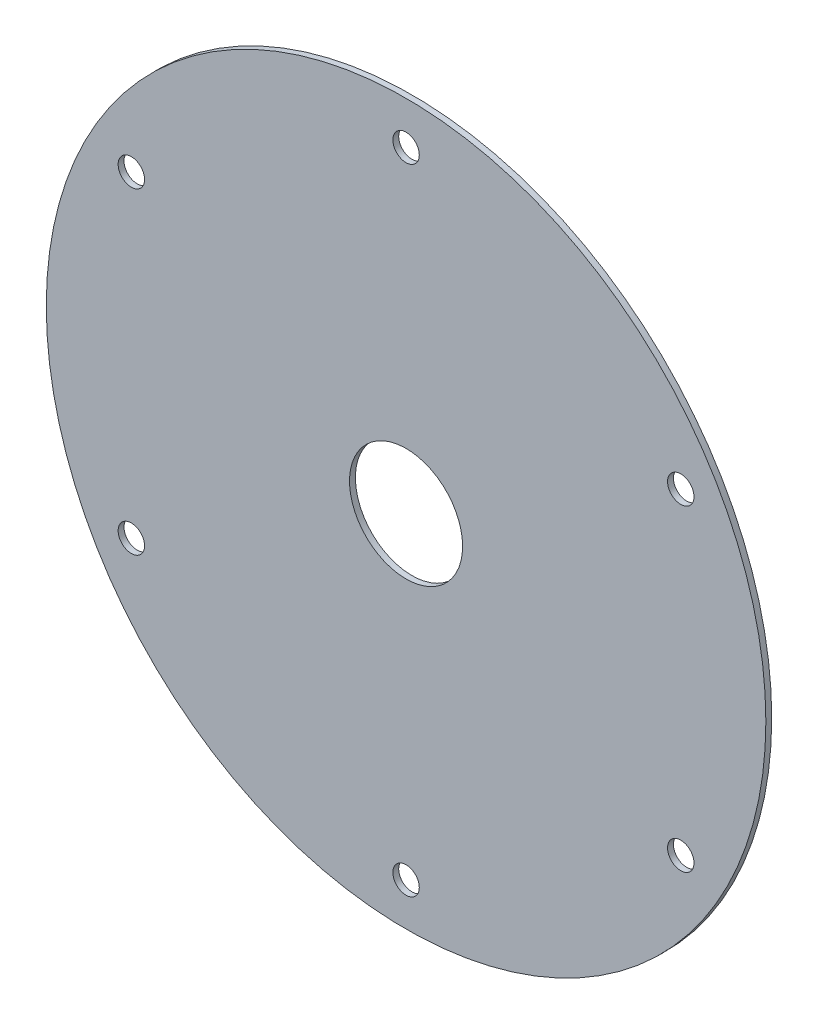
ISO-10303-21;
HEADER;
FILE_DESCRIPTION(('STEP AP214'),'2;1');
FILE_NAME('part.step','',(''),(''),'','','');
FILE_SCHEMA(('AUTOMOTIVE_DESIGN { 1 0 10303 214 1 1 1 1 }'));
ENDSEC;
DATA;
#1=APPLICATION_CONTEXT('core data for automotive mechanical design processes');
#2=APPLICATION_PROTOCOL_DEFINITION('international standard','automotive_design',2000,#1);
#3=PRODUCT_CONTEXT('',#1,'mechanical');
#4=PRODUCT('Part','Part','',(#3));
#5=PRODUCT_RELATED_PRODUCT_CATEGORY('part','',(#4));
#6=PRODUCT_DEFINITION_FORMATION('','',#4);
#7=PRODUCT_DEFINITION_CONTEXT('part definition',#1,'design');
#8=PRODUCT_DEFINITION('design','',#6,#7);
#9=PRODUCT_DEFINITION_SHAPE('','',#8);
#10=(LENGTH_UNIT() NAMED_UNIT(*) SI_UNIT(.MILLI.,.METRE.));
#11=(NAMED_UNIT(*) PLANE_ANGLE_UNIT() SI_UNIT($,.RADIAN.));
#12=(NAMED_UNIT(*) SI_UNIT($,.STERADIAN.) SOLID_ANGLE_UNIT());
#13=UNCERTAINTY_MEASURE_WITH_UNIT(LENGTH_MEASURE(1.E-05),#10,'distance_accuracy_value','');
#14=(GEOMETRIC_REPRESENTATION_CONTEXT(3) GLOBAL_UNCERTAINTY_ASSIGNED_CONTEXT((#13)) GLOBAL_UNIT_ASSIGNED_CONTEXT((#10,
#11,#12)) REPRESENTATION_CONTEXT('',''));
#15=CARTESIAN_POINT('',(0.,0.,0.));
#16=DIRECTION('',(0.,0.,1.));
#17=DIRECTION('',(1.,0.,0.));
#18=AXIS2_PLACEMENT_3D('',#15,#16,#17);
#19=CARTESIAN_POINT('',(0.,0.,4.));
#20=DIRECTION('',(0.,0.,1.));
#21=DIRECTION('',(1.,0.,0.));
#22=AXIS2_PLACEMENT_3D('',#19,#20,#21);
#23=PLANE('',#22);
#24=CARTESIAN_POINT('',(-187.061487217439,-108.,4.));
#25=DIRECTION('',(0.,0.,1.));
#26=DIRECTION('',(1.,0.,0.));
#27=AXIS2_PLACEMENT_3D('',#24,#25,#26);
#28=CIRCLE('',#27,9.00000000000001);
#29=CARTESIAN_POINT('',(-178.061487217439,-108.,4.));
#30=VERTEX_POINT('',#29);
#31=EDGE_CURVE('E75',#30,#30,#28,.T.);
#32=ORIENTED_EDGE('',*,*,#31,.F.);
#33=EDGE_LOOP('',(#32));
#34=FACE_BOUND('',#33,.T.);
#35=CARTESIAN_POINT('',(187.061487217439,-108.,4.));
#36=DIRECTION('',(0.,0.,1.));
#37=DIRECTION('',(1.,0.,0.));
#38=AXIS2_PLACEMENT_3D('',#35,#36,#37);
#39=CIRCLE('',#38,9.00000000000001);
#40=CARTESIAN_POINT('',(196.061487217439,-108.,4.));
#41=VERTEX_POINT('',#40);
#42=EDGE_CURVE('E63',#41,#41,#39,.T.);
#43=ORIENTED_EDGE('',*,*,#42,.F.);
#44=EDGE_LOOP('',(#43));
#45=FACE_BOUND('',#44,.T.);
#46=CARTESIAN_POINT('',(0.,216.,4.));
#47=DIRECTION('',(0.,0.,1.));
#48=DIRECTION('',(1.,0.,0.));
#49=AXIS2_PLACEMENT_3D('',#46,#47,#48);
#50=CIRCLE('',#49,9.);
#51=CARTESIAN_POINT('',(9.,216.,4.));
#52=VERTEX_POINT('',#51);
#53=EDGE_CURVE('E51',#52,#52,#50,.T.);
#54=ORIENTED_EDGE('',*,*,#53,.F.);
#55=EDGE_LOOP('',(#54));
#56=FACE_BOUND('',#55,.T.);
#57=CARTESIAN_POINT('',(0.,0.,4.));
#58=DIRECTION('',(0.,0.,1.));
#59=DIRECTION('',(1.,0.,0.));
#60=AXIS2_PLACEMENT_3D('',#57,#58,#59);
#61=CIRCLE('',#60,245.);
#62=CARTESIAN_POINT('',(245.,0.,4.));
#63=VERTEX_POINT('',#62);
#64=EDGE_CURVE('E10',#63,#63,#61,.T.);
#65=ORIENTED_EDGE('',*,*,#64,.T.);
#66=EDGE_LOOP('',(#65));
#67=FACE_BOUND('',#66,.T.);
#68=CARTESIAN_POINT('',(0.,0.,4.));
#69=DIRECTION('',(0.,0.,1.));
#70=DIRECTION('',(1.,0.,0.));
#71=AXIS2_PLACEMENT_3D('',#68,#69,#70);
#72=CIRCLE('',#71,38.5);
#73=CARTESIAN_POINT('',(38.5,0.,4.));
#74=VERTEX_POINT('',#73);
#75=EDGE_CURVE('E46',#74,#74,#72,.T.);
#76=ORIENTED_EDGE('',*,*,#75,.F.);
#77=EDGE_LOOP('',(#76));
#78=FACE_BOUND('',#77,.T.);
#79=CARTESIAN_POINT('',(187.061487217439,108.,4.));
#80=DIRECTION('',(0.,0.,1.));
#81=DIRECTION('',(1.,0.,0.));
#82=AXIS2_PLACEMENT_3D('',#79,#80,#81);
#83=CIRCLE('',#82,8.99999999999998);
#84=CARTESIAN_POINT('',(196.061487217439,108.,4.));
#85=VERTEX_POINT('',#84);
#86=EDGE_CURVE('E57',#85,#85,#83,.T.);
#87=ORIENTED_EDGE('',*,*,#86,.F.);
#88=EDGE_LOOP('',(#87));
#89=FACE_BOUND('',#88,.T.);
#90=CARTESIAN_POINT('',(0.,-216.,4.));
#91=DIRECTION('',(0.,0.,1.));
#92=DIRECTION('',(1.,0.,0.));
#93=AXIS2_PLACEMENT_3D('',#90,#91,#92);
#94=CIRCLE('',#93,9.);
#95=CARTESIAN_POINT('',(9.00000000000002,-216.,4.));
#96=VERTEX_POINT('',#95);
#97=EDGE_CURVE('E69',#96,#96,#94,.T.);
#98=ORIENTED_EDGE('',*,*,#97,.F.);
#99=EDGE_LOOP('',(#98));
#100=FACE_BOUND('',#99,.T.);
#101=CARTESIAN_POINT('',(-187.061487217439,108.,4.));
#102=DIRECTION('',(0.,0.,1.));
#103=DIRECTION('',(1.,0.,0.));
#104=AXIS2_PLACEMENT_3D('',#101,#102,#103);
#105=CIRCLE('',#104,8.99999999999998);
#106=CARTESIAN_POINT('',(-178.061487217439,108.,4.));
#107=VERTEX_POINT('',#106);
#108=EDGE_CURVE('E81',#107,#107,#105,.T.);
#109=ORIENTED_EDGE('',*,*,#108,.F.);
#110=EDGE_LOOP('',(#109));
#111=FACE_BOUND('',#110,.T.);
#112=ADVANCED_FACE('F35',(#34,#45,#56,#67,#78,#89,#100,#111),#23,.T.);
#113=CARTESIAN_POINT('',(0.,0.,0.));
#114=DIRECTION('',(0.,0.,1.));
#115=DIRECTION('',(1.,0.,0.));
#116=AXIS2_PLACEMENT_3D('',#113,#114,#115);
#117=PLANE('',#116);
#118=CARTESIAN_POINT('',(0.,0.,0.));
#119=DIRECTION('',(0.,0.,1.));
#120=DIRECTION('',(1.,0.,0.));
#121=AXIS2_PLACEMENT_3D('',#118,#119,#120);
#122=CIRCLE('',#121,245.);
#123=CARTESIAN_POINT('',(245.,0.,0.));
#124=VERTEX_POINT('',#123);
#125=EDGE_CURVE('E39',#124,#124,#122,.T.);
#126=ORIENTED_EDGE('',*,*,#125,.F.);
#127=EDGE_LOOP('',(#126));
#128=FACE_BOUND('',#127,.T.);
#129=CARTESIAN_POINT('',(0.,0.,0.));
#130=DIRECTION('',(0.,0.,1.));
#131=DIRECTION('',(1.,0.,0.));
#132=AXIS2_PLACEMENT_3D('',#129,#130,#131);
#133=CIRCLE('',#132,38.5);
#134=CARTESIAN_POINT('',(38.5,0.,0.));
#135=VERTEX_POINT('',#134);
#136=EDGE_CURVE('E48',#135,#135,#133,.T.);
#137=ORIENTED_EDGE('',*,*,#136,.T.);
#138=EDGE_LOOP('',(#137));
#139=FACE_BOUND('',#138,.T.);
#140=CARTESIAN_POINT('',(0.,216.,0.));
#141=DIRECTION('',(0.,0.,1.));
#142=DIRECTION('',(1.,0.,0.));
#143=AXIS2_PLACEMENT_3D('',#140,#141,#142);
#144=CIRCLE('',#143,9.);
#145=CARTESIAN_POINT('',(9.,216.,0.));
#146=VERTEX_POINT('',#145);
#147=EDGE_CURVE('E54',#146,#146,#144,.T.);
#148=ORIENTED_EDGE('',*,*,#147,.T.);
#149=EDGE_LOOP('',(#148));
#150=FACE_BOUND('',#149,.T.);
#151=CARTESIAN_POINT('',(187.061487217439,108.,0.));
#152=DIRECTION('',(0.,0.,1.));
#153=DIRECTION('',(1.,0.,0.));
#154=AXIS2_PLACEMENT_3D('',#151,#152,#153);
#155=CIRCLE('',#154,8.99999999999998);
#156=CARTESIAN_POINT('',(196.061487217439,108.,0.));
#157=VERTEX_POINT('',#156);
#158=EDGE_CURVE('E60',#157,#157,#155,.T.);
#159=ORIENTED_EDGE('',*,*,#158,.T.);
#160=EDGE_LOOP('',(#159));
#161=FACE_BOUND('',#160,.T.);
#162=CARTESIAN_POINT('',(187.061487217439,-108.,0.));
#163=DIRECTION('',(0.,0.,1.));
#164=DIRECTION('',(1.,0.,0.));
#165=AXIS2_PLACEMENT_3D('',#162,#163,#164);
#166=CIRCLE('',#165,9.00000000000001);
#167=CARTESIAN_POINT('',(196.061487217439,-108.,0.));
#168=VERTEX_POINT('',#167);
#169=EDGE_CURVE('E66',#168,#168,#166,.T.);
#170=ORIENTED_EDGE('',*,*,#169,.T.);
#171=EDGE_LOOP('',(#170));
#172=FACE_BOUND('',#171,.T.);
#173=CARTESIAN_POINT('',(0.,-216.,0.));
#174=DIRECTION('',(0.,0.,1.));
#175=DIRECTION('',(1.,0.,0.));
#176=AXIS2_PLACEMENT_3D('',#173,#174,#175);
#177=CIRCLE('',#176,9.);
#178=CARTESIAN_POINT('',(9.00000000000002,-216.,0.));
#179=VERTEX_POINT('',#178);
#180=EDGE_CURVE('E72',#179,#179,#177,.T.);
#181=ORIENTED_EDGE('',*,*,#180,.T.);
#182=EDGE_LOOP('',(#181));
#183=FACE_BOUND('',#182,.T.);
#184=CARTESIAN_POINT('',(-187.061487217439,-108.,0.));
#185=DIRECTION('',(0.,0.,1.));
#186=DIRECTION('',(1.,0.,0.));
#187=AXIS2_PLACEMENT_3D('',#184,#185,#186);
#188=CIRCLE('',#187,9.00000000000001);
#189=CARTESIAN_POINT('',(-178.061487217439,-108.,0.));
#190=VERTEX_POINT('',#189);
#191=EDGE_CURVE('E78',#190,#190,#188,.T.);
#192=ORIENTED_EDGE('',*,*,#191,.T.);
#193=EDGE_LOOP('',(#192));
#194=FACE_BOUND('',#193,.T.);
#195=CARTESIAN_POINT('',(-187.061487217439,108.,0.));
#196=DIRECTION('',(0.,0.,1.));
#197=DIRECTION('',(1.,0.,0.));
#198=AXIS2_PLACEMENT_3D('',#195,#196,#197);
#199=CIRCLE('',#198,8.99999999999998);
#200=CARTESIAN_POINT('',(-178.061487217439,108.,0.));
#201=VERTEX_POINT('',#200);
#202=EDGE_CURVE('E84',#201,#201,#199,.T.);
#203=ORIENTED_EDGE('',*,*,#202,.T.);
#204=EDGE_LOOP('',(#203));
#205=FACE_BOUND('',#204,.T.);
#206=ADVANCED_FACE('F94',(#128,#139,#150,#161,#172,#183,#194,#205),#117,.F.);
#207=CARTESIAN_POINT('',(0.,0.,4.));
#208=DIRECTION('',(0.,0.,-1.));
#209=DIRECTION('',(-1.,0.,0.));
#210=AXIS2_PLACEMENT_3D('',#207,#208,#209);
#211=CYLINDRICAL_SURFACE('',#210,245.);
#212=ORIENTED_EDGE('',*,*,#64,.F.);
#213=EDGE_LOOP('',(#212));
#214=FACE_BOUND('',#213,.T.);
#215=ORIENTED_EDGE('',*,*,#125,.T.);
#216=EDGE_LOOP('',(#215));
#217=FACE_BOUND('',#216,.T.);
#218=ADVANCED_FACE('F37',(#214,#217),#211,.T.);
#219=CARTESIAN_POINT('',(0.,0.,4.));
#220=DIRECTION('',(0.,0.,-1.));
#221=DIRECTION('',(-1.,0.,0.));
#222=AXIS2_PLACEMENT_3D('',#219,#220,#221);
#223=CYLINDRICAL_SURFACE('',#222,38.5);
#224=ORIENTED_EDGE('',*,*,#75,.T.);
#225=EDGE_LOOP('',(#224));
#226=FACE_BOUND('',#225,.T.);
#227=ORIENTED_EDGE('',*,*,#136,.F.);
#228=EDGE_LOOP('',(#227));
#229=FACE_BOUND('',#228,.T.);
#230=ADVANCED_FACE('F104',(#226,#229),#223,.F.);
#231=CARTESIAN_POINT('',(0.,216.,4.));
#232=DIRECTION('',(0.,0.,-1.));
#233=DIRECTION('',(-1.,0.,0.));
#234=AXIS2_PLACEMENT_3D('',#231,#232,#233);
#235=CYLINDRICAL_SURFACE('',#234,9.);
#236=ORIENTED_EDGE('',*,*,#53,.T.);
#237=EDGE_LOOP('',(#236));
#238=FACE_BOUND('',#237,.T.);
#239=ORIENTED_EDGE('',*,*,#147,.F.);
#240=EDGE_LOOP('',(#239));
#241=FACE_BOUND('',#240,.T.);
#242=ADVANCED_FACE('F107',(#238,#241),#235,.F.);
#243=CARTESIAN_POINT('',(187.061487217439,108.,4.));
#244=DIRECTION('',(0.,0.,-1.));
#245=DIRECTION('',(-1.,0.,0.));
#246=AXIS2_PLACEMENT_3D('',#243,#244,#245);
#247=CYLINDRICAL_SURFACE('',#246,8.99999999999998);
#248=ORIENTED_EDGE('',*,*,#86,.T.);
#249=EDGE_LOOP('',(#248));
#250=FACE_BOUND('',#249,.T.);
#251=ORIENTED_EDGE('',*,*,#158,.F.);
#252=EDGE_LOOP('',(#251));
#253=FACE_BOUND('',#252,.T.);
#254=ADVANCED_FACE('F111',(#250,#253),#247,.F.);
#255=CARTESIAN_POINT('',(187.061487217439,-108.,4.));
#256=DIRECTION('',(0.,0.,-1.));
#257=DIRECTION('',(-1.,0.,0.));
#258=AXIS2_PLACEMENT_3D('',#255,#256,#257);
#259=CYLINDRICAL_SURFACE('',#258,9.00000000000001);
#260=ORIENTED_EDGE('',*,*,#42,.T.);
#261=EDGE_LOOP('',(#260));
#262=FACE_BOUND('',#261,.T.);
#263=ORIENTED_EDGE('',*,*,#169,.F.);
#264=EDGE_LOOP('',(#263));
#265=FACE_BOUND('',#264,.T.);
#266=ADVANCED_FACE('F115',(#262,#265),#259,.F.);
#267=CARTESIAN_POINT('',(0.,-216.,4.));
#268=DIRECTION('',(0.,0.,-1.));
#269=DIRECTION('',(-1.,0.,0.));
#270=AXIS2_PLACEMENT_3D('',#267,#268,#269);
#271=CYLINDRICAL_SURFACE('',#270,9.);
#272=ORIENTED_EDGE('',*,*,#97,.T.);
#273=EDGE_LOOP('',(#272));
#274=FACE_BOUND('',#273,.T.);
#275=ORIENTED_EDGE('',*,*,#180,.F.);
#276=EDGE_LOOP('',(#275));
#277=FACE_BOUND('',#276,.T.);
#278=ADVANCED_FACE('F119',(#274,#277),#271,.F.);
#279=CARTESIAN_POINT('',(-187.061487217439,-108.,4.));
#280=DIRECTION('',(0.,0.,-1.));
#281=DIRECTION('',(-1.,0.,0.));
#282=AXIS2_PLACEMENT_3D('',#279,#280,#281);
#283=CYLINDRICAL_SURFACE('',#282,9.00000000000001);
#284=ORIENTED_EDGE('',*,*,#31,.T.);
#285=EDGE_LOOP('',(#284));
#286=FACE_BOUND('',#285,.T.);
#287=ORIENTED_EDGE('',*,*,#191,.F.);
#288=EDGE_LOOP('',(#287));
#289=FACE_BOUND('',#288,.T.);
#290=ADVANCED_FACE('F123',(#286,#289),#283,.F.);
#291=CARTESIAN_POINT('',(-187.061487217439,108.,4.));
#292=DIRECTION('',(0.,0.,-1.));
#293=DIRECTION('',(-1.,0.,0.));
#294=AXIS2_PLACEMENT_3D('',#291,#292,#293);
#295=CYLINDRICAL_SURFACE('',#294,8.99999999999998);
#296=ORIENTED_EDGE('',*,*,#108,.T.);
#297=EDGE_LOOP('',(#296));
#298=FACE_BOUND('',#297,.T.);
#299=ORIENTED_EDGE('',*,*,#202,.F.);
#300=EDGE_LOOP('',(#299));
#301=FACE_BOUND('',#300,.T.);
#302=ADVANCED_FACE('F90',(#298,#301),#295,.F.);
#303=CLOSED_SHELL('',(#112,#206,#218,#230,#242,#254,#266,#278,#290,#302));
#304=MANIFOLD_SOLID_BREP('B2',#303);
#305=ADVANCED_BREP_SHAPE_REPRESENTATION('',(#18,#304),#14);
#306=SHAPE_DEFINITION_REPRESENTATION(#9,#305);
ENDSEC;
END-ISO-10303-21;
